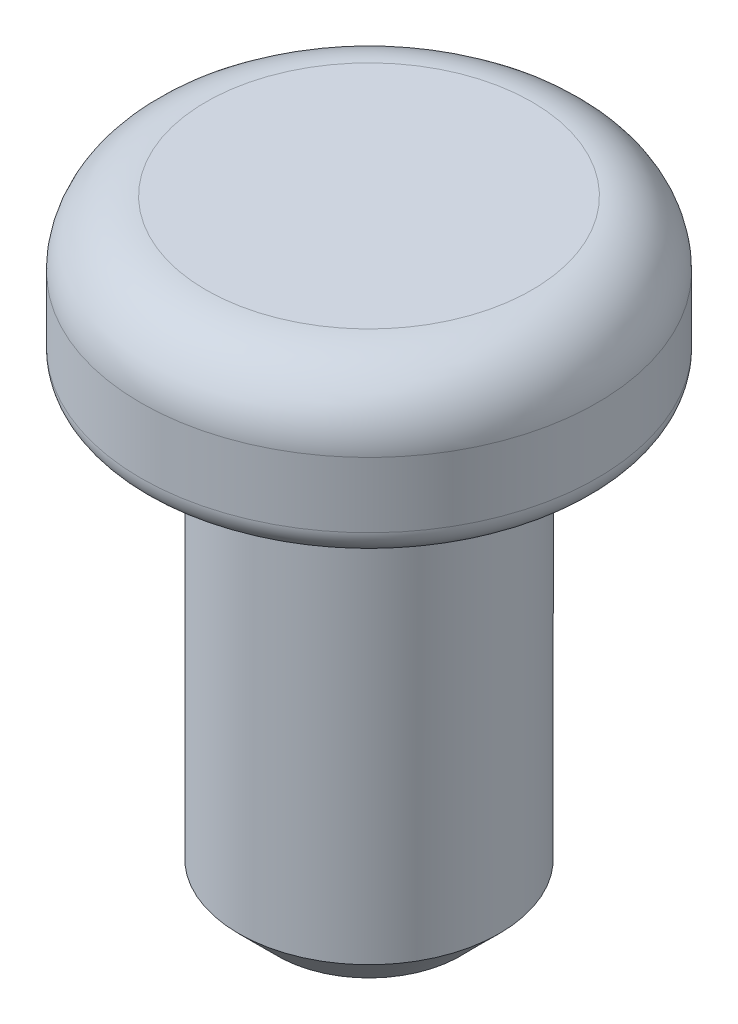
ISO-10303-21;
HEADER;
FILE_DESCRIPTION(('STEP AP214'),'2;1');
FILE_NAME('part.step','',(''),(''),'','','');
FILE_SCHEMA(('AUTOMOTIVE_DESIGN { 1 0 10303 214 1 1 1 1 }'));
ENDSEC;
DATA;
#1=APPLICATION_CONTEXT('core data for automotive mechanical design processes');
#2=APPLICATION_PROTOCOL_DEFINITION('international standard','automotive_design',2000,#1);
#3=PRODUCT_CONTEXT('',#1,'mechanical');
#4=PRODUCT('Part','Part','',(#3));
#5=PRODUCT_RELATED_PRODUCT_CATEGORY('part','',(#4));
#6=PRODUCT_DEFINITION_FORMATION('','',#4);
#7=PRODUCT_DEFINITION_CONTEXT('part definition',#1,'design');
#8=PRODUCT_DEFINITION('design','',#6,#7);
#9=PRODUCT_DEFINITION_SHAPE('','',#8);
#10=(LENGTH_UNIT() NAMED_UNIT(*) SI_UNIT(.MILLI.,.METRE.));
#11=(NAMED_UNIT(*) PLANE_ANGLE_UNIT() SI_UNIT($,.RADIAN.));
#12=(NAMED_UNIT(*) SI_UNIT($,.STERADIAN.) SOLID_ANGLE_UNIT());
#13=UNCERTAINTY_MEASURE_WITH_UNIT(LENGTH_MEASURE(1.E-05),#10,'distance_accuracy_value','');
#14=(GEOMETRIC_REPRESENTATION_CONTEXT(3) GLOBAL_UNCERTAINTY_ASSIGNED_CONTEXT((#13)) GLOBAL_UNIT_ASSIGNED_CONTEXT((#10,
#11,#12)) REPRESENTATION_CONTEXT('',''));
#15=CARTESIAN_POINT('',(0.,0.,0.));
#16=DIRECTION('',(0.,0.,1.));
#17=DIRECTION('',(1.,0.,0.));
#18=AXIS2_PLACEMENT_3D('',#15,#16,#17);
#19=CARTESIAN_POINT('',(0.,0.,0.));
#20=DIRECTION('',(0.,1.,0.));
#21=DIRECTION('',(0.,0.,1.));
#22=AXIS2_PLACEMENT_3D('',#19,#20,#21);
#23=PLANE('',#22);
#24=CARTESIAN_POINT('',(0.,0.,0.));
#25=DIRECTION('',(0.,1.,0.));
#26=DIRECTION('',(0.,0.,1.));
#27=AXIS2_PLACEMENT_3D('',#24,#25,#26);
#28=CIRCLE('',#27,1.55);
#29=CARTESIAN_POINT('',(0.,0.,1.55));
#30=VERTEX_POINT('',#29);
#31=EDGE_CURVE('E10',#30,#30,#28,.F.);
#32=ORIENTED_EDGE('',*,*,#31,.T.);
#33=EDGE_LOOP('',(#32));
#34=FACE_BOUND('',#33,.T.);
#35=CARTESIAN_POINT('',(0.,0.,0.));
#36=DIRECTION('',(0.,1.,0.));
#37=DIRECTION('',(0.,0.,1.));
#38=AXIS2_PLACEMENT_3D('',#35,#36,#37);
#39=CIRCLE('',#38,1.);
#40=CARTESIAN_POINT('',(0.,0.,1.));
#41=VERTEX_POINT('',#40);
#42=EDGE_CURVE('E40',#41,#41,#39,.F.);
#43=ORIENTED_EDGE('',*,*,#42,.F.);
#44=EDGE_LOOP('',(#43));
#45=FACE_BOUND('',#44,.T.);
#46=ADVANCED_FACE('F14',(#34,#45),#23,.F.);
#47=CARTESIAN_POINT('',(0.,1.2,0.));
#48=DIRECTION('',(0.,-1.,0.));
#49=DIRECTION('',(0.,0.,-1.));
#50=AXIS2_PLACEMENT_3D('',#47,#48,#49);
#51=CYLINDRICAL_SURFACE('',#50,1.75);
#52=CARTESIAN_POINT('',(0.,0.2,0.));
#53=DIRECTION('',(0.,1.,0.));
#54=DIRECTION('',(0.,0.,1.));
#55=AXIS2_PLACEMENT_3D('',#52,#53,#54);
#56=CIRCLE('',#55,1.75);
#57=CARTESIAN_POINT('',(0.,0.2,1.75));
#58=VERTEX_POINT('',#57);
#59=EDGE_CURVE('E21',#58,#58,#56,.T.);
#60=ORIENTED_EDGE('',*,*,#59,.T.);
#61=EDGE_LOOP('',(#60));
#62=FACE_BOUND('',#61,.T.);
#63=CARTESIAN_POINT('',(0.,0.7,0.));
#64=DIRECTION('',(0.,1.,0.));
#65=DIRECTION('',(0.,0.,1.));
#66=AXIS2_PLACEMENT_3D('',#63,#64,#65);
#67=CIRCLE('',#66,1.75);
#68=CARTESIAN_POINT('',(0.,0.7,1.75));
#69=VERTEX_POINT('',#68);
#70=EDGE_CURVE('E25',#69,#69,#67,.F.);
#71=ORIENTED_EDGE('',*,*,#70,.T.);
#72=EDGE_LOOP('',(#71));
#73=FACE_BOUND('',#72,.T.);
#74=ADVANCED_FACE('F47',(#62,#73),#51,.T.);
#75=CARTESIAN_POINT('',(0.,1.2,0.));
#76=DIRECTION('',(0.,1.,0.));
#77=DIRECTION('',(0.,0.,1.));
#78=AXIS2_PLACEMENT_3D('',#75,#76,#77);
#79=PLANE('',#78);
#80=CARTESIAN_POINT('',(0.,1.2,0.));
#81=DIRECTION('',(0.,1.,0.));
#82=DIRECTION('',(0.,0.,1.));
#83=AXIS2_PLACEMENT_3D('',#80,#81,#82);
#84=CIRCLE('',#83,1.25);
#85=CARTESIAN_POINT('',(0.,1.2,1.25));
#86=VERTEX_POINT('',#85);
#87=EDGE_CURVE('E29',#86,#86,#84,.T.);
#88=ORIENTED_EDGE('',*,*,#87,.T.);
#89=EDGE_LOOP('',(#88));
#90=FACE_BOUND('',#89,.T.);
#91=ADVANCED_FACE('F54',(#90),#79,.T.);
#92=CARTESIAN_POINT('',(0.,-3.5,0.));
#93=DIRECTION('',(0.,1.,0.));
#94=DIRECTION('',(0.,0.,1.));
#95=AXIS2_PLACEMENT_3D('',#92,#93,#94);
#96=CYLINDRICAL_SURFACE('',#95,1.);
#97=CARTESIAN_POINT('',(0.,-3.2,0.));
#98=DIRECTION('',(0.,-1.,0.));
#99=DIRECTION('',(0.,0.,-1.));
#100=AXIS2_PLACEMENT_3D('',#97,#98,#99);
#101=CIRCLE('',#100,1.);
#102=CARTESIAN_POINT('',(0.,-3.2,-1.));
#103=VERTEX_POINT('',#102);
#104=EDGE_CURVE('E34',#103,#103,#101,.F.);
#105=ORIENTED_EDGE('',*,*,#104,.T.);
#106=EDGE_LOOP('',(#105));
#107=FACE_BOUND('',#106,.T.);
#108=ORIENTED_EDGE('',*,*,#42,.T.);
#109=EDGE_LOOP('',(#108));
#110=FACE_BOUND('',#109,.T.);
#111=ADVANCED_FACE('F44',(#107,#110),#96,.T.);
#112=CARTESIAN_POINT('',(0.,-3.5,0.));
#113=DIRECTION('',(0.,-1.,0.));
#114=DIRECTION('',(0.,0.,-1.));
#115=AXIS2_PLACEMENT_3D('',#112,#113,#114);
#116=PLANE('',#115);
#117=CARTESIAN_POINT('',(0.,-3.5,0.));
#118=DIRECTION('',(0.,-1.,0.));
#119=DIRECTION('',(0.,0.,-1.));
#120=AXIS2_PLACEMENT_3D('',#117,#118,#119);
#121=CIRCLE('',#120,0.7);
#122=CARTESIAN_POINT('',(0.,-3.5,-0.7));
#123=VERTEX_POINT('',#122);
#124=EDGE_CURVE('E37',#123,#123,#121,.T.);
#125=ORIENTED_EDGE('',*,*,#124,.T.);
#126=EDGE_LOOP('',(#125));
#127=FACE_BOUND('',#126,.T.);
#128=ADVANCED_FACE('F62',(#127),#116,.T.);
#129=CARTESIAN_POINT('',(0.,-3.5,0.));
#130=DIRECTION('',(0.,1.,0.));
#131=DIRECTION('',(0.,0.,1.));
#132=AXIS2_PLACEMENT_3D('',#129,#130,#131);
#133=CONICAL_SURFACE('',#132,0.7,0.785398163397449);
#134=ORIENTED_EDGE('',*,*,#104,.F.);
#135=EDGE_LOOP('',(#134));
#136=FACE_BOUND('',#135,.T.);
#137=ORIENTED_EDGE('',*,*,#124,.F.);
#138=EDGE_LOOP('',(#137));
#139=FACE_BOUND('',#138,.T.);
#140=ADVANCED_FACE('F59',(#136,#139),#133,.T.);
#141=CARTESIAN_POINT('',(0.,0.7,0.));
#142=DIRECTION('',(0.,1.,0.));
#143=DIRECTION('',(0.,0.,1.));
#144=AXIS2_PLACEMENT_3D('',#141,#142,#143);
#145=TOROIDAL_SURFACE('',#144,1.25,0.5);
#146=ORIENTED_EDGE('',*,*,#70,.F.);
#147=EDGE_LOOP('',(#146));
#148=FACE_BOUND('',#147,.T.);
#149=ORIENTED_EDGE('',*,*,#87,.F.);
#150=EDGE_LOOP('',(#149));
#151=FACE_BOUND('',#150,.T.);
#152=ADVANCED_FACE('F61',(#148,#151),#145,.T.);
#153=CARTESIAN_POINT('',(0.,0.2,0.));
#154=DIRECTION('',(0.,1.,0.));
#155=DIRECTION('',(0.,0.,1.));
#156=AXIS2_PLACEMENT_3D('',#153,#154,#155);
#157=TOROIDAL_SURFACE('',#156,1.55,0.2);
#158=ORIENTED_EDGE('',*,*,#31,.F.);
#159=EDGE_LOOP('',(#158));
#160=FACE_BOUND('',#159,.T.);
#161=ORIENTED_EDGE('',*,*,#59,.F.);
#162=EDGE_LOOP('',(#161));
#163=FACE_BOUND('',#162,.T.);
#164=ADVANCED_FACE('F16',(#160,#163),#157,.T.);
#165=CLOSED_SHELL('',(#46,#74,#91,#111,#128,#140,#152,#164));
#166=MANIFOLD_SOLID_BREP('B1',#165);
#167=ADVANCED_BREP_SHAPE_REPRESENTATION('',(#18,#166),#14);
#168=SHAPE_DEFINITION_REPRESENTATION(#9,#167);
ENDSEC;
END-ISO-10303-21;
